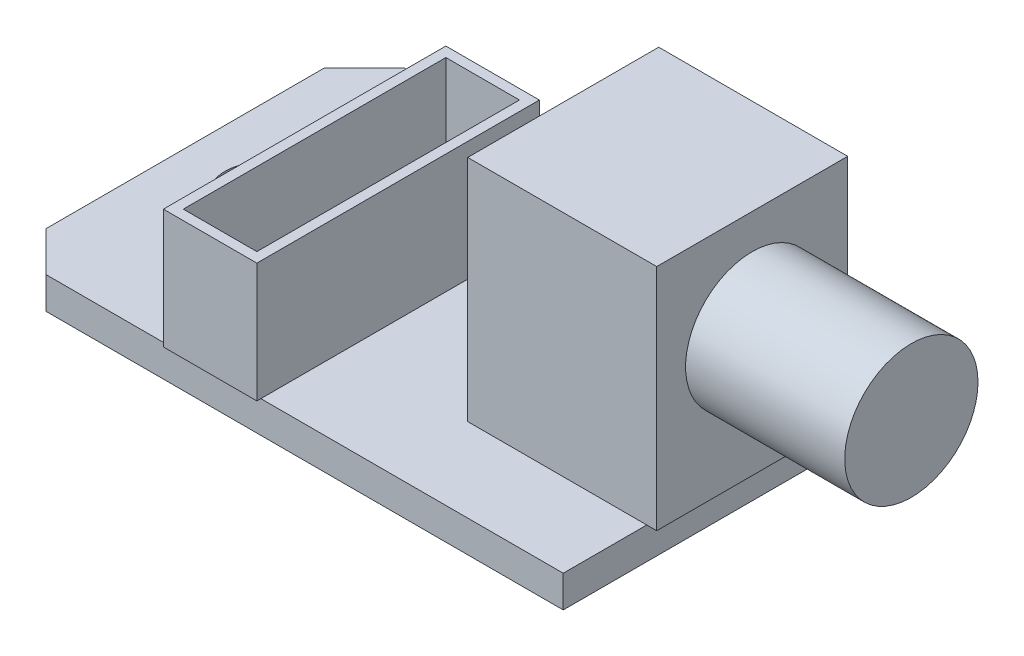
ISO-10303-21;
HEADER;
FILE_DESCRIPTION(('STEP AP214'),'2;1');
FILE_NAME('part.step','',(''),(''),'','','');
FILE_SCHEMA(('AUTOMOTIVE_DESIGN { 1 0 10303 214 1 1 1 1 }'));
ENDSEC;
DATA;
#1=APPLICATION_CONTEXT('core data for automotive mechanical design processes');
#2=APPLICATION_PROTOCOL_DEFINITION('international standard','automotive_design',2000,#1);
#3=PRODUCT_CONTEXT('',#1,'mechanical');
#4=PRODUCT('Part','Part','',(#3));
#5=PRODUCT_RELATED_PRODUCT_CATEGORY('part','',(#4));
#6=PRODUCT_DEFINITION_FORMATION('','',#4);
#7=PRODUCT_DEFINITION_CONTEXT('part definition',#1,'design');
#8=PRODUCT_DEFINITION('design','',#6,#7);
#9=PRODUCT_DEFINITION_SHAPE('','',#8);
#10=(LENGTH_UNIT() NAMED_UNIT(*) SI_UNIT(.MILLI.,.METRE.));
#11=(NAMED_UNIT(*) PLANE_ANGLE_UNIT() SI_UNIT($,.RADIAN.));
#12=(NAMED_UNIT(*) SI_UNIT($,.STERADIAN.) SOLID_ANGLE_UNIT());
#13=UNCERTAINTY_MEASURE_WITH_UNIT(LENGTH_MEASURE(1.E-05),#10,'distance_accuracy_value','');
#14=(GEOMETRIC_REPRESENTATION_CONTEXT(3) GLOBAL_UNCERTAINTY_ASSIGNED_CONTEXT((#13)) GLOBAL_UNIT_ASSIGNED_CONTEXT((#10,
#11,#12)) REPRESENTATION_CONTEXT('',''));
#15=CARTESIAN_POINT('',(0.,0.,0.));
#16=DIRECTION('',(0.,0.,1.));
#17=DIRECTION('',(1.,0.,0.));
#18=AXIS2_PLACEMENT_3D('',#15,#16,#17);
#19=CARTESIAN_POINT('',(0.,1.6,0.));
#20=DIRECTION('',(0.,1.,0.));
#21=DIRECTION('',(0.,0.,1.));
#22=AXIS2_PLACEMENT_3D('',#19,#20,#21);
#23=PLANE('',#22);
#24=CARTESIAN_POINT('',(-10.1,1.6,0.));
#25=DIRECTION('',(0.,1.,0.));
#26=DIRECTION('',(0.,0.,1.));
#27=AXIS2_PLACEMENT_3D('',#24,#25,#26);
#28=CIRCLE('',#27,1.9);
#29=CARTESIAN_POINT('',(-10.1,1.6,1.9));
#30=VERTEX_POINT('',#29);
#31=EDGE_CURVE('E205',#30,#30,#28,.T.);
#32=ORIENTED_EDGE('',*,*,#31,.F.);
#33=EDGE_LOOP('',(#32));
#34=FACE_BOUND('',#33,.T.);
#35=DIRECTION('',(-1.,0.,0.));
#36=VECTOR('',#35,1.);
#37=CARTESIAN_POINT('',(14.,1.6,-9.));
#38=LINE('',#37,#36);
#39=CARTESIAN_POINT('',(14.,1.6,-9.));
#40=VERTEX_POINT('',#39);
#41=CARTESIAN_POINT('',(-12.,1.6,-9.));
#42=VERTEX_POINT('',#41);
#43=EDGE_CURVE('E304',#40,#42,#38,.T.);
#44=ORIENTED_EDGE('',*,*,#43,.T.);
#45=DIRECTION('',(0.707106781186548,0.,-0.707106781186547));
#46=VECTOR('',#45,1.);
#47=CARTESIAN_POINT('',(-10.5,1.6,-10.5));
#48=LINE('',#47,#46);
#49=CARTESIAN_POINT('',(-14.,1.6,-6.99999999999999));
#50=VERTEX_POINT('',#49);
#51=EDGE_CURVE('E40',#42,#50,#48,.F.);
#52=ORIENTED_EDGE('',*,*,#51,.T.);
#53=DIRECTION('',(0.,0.,1.));
#54=VECTOR('',#53,1.);
#55=CARTESIAN_POINT('',(-14.,1.6,9.));
#56=LINE('',#55,#54);
#57=CARTESIAN_POINT('',(-14.,1.6,7.));
#58=VERTEX_POINT('',#57);
#59=EDGE_CURVE('E293',#50,#58,#56,.T.);
#60=ORIENTED_EDGE('',*,*,#59,.T.);
#61=DIRECTION('',(-0.707106781186547,0.,-0.707106781186548));
#62=VECTOR('',#61,1.);
#63=CARTESIAN_POINT('',(-10.5,1.6,10.5));
#64=LINE('',#63,#62);
#65=CARTESIAN_POINT('',(-12.,1.6,9.));
#66=VERTEX_POINT('',#65);
#67=EDGE_CURVE('E55',#58,#66,#64,.F.);
#68=ORIENTED_EDGE('',*,*,#67,.T.);
#69=DIRECTION('',(1.,0.,0.));
#70=VECTOR('',#69,1.);
#71=CARTESIAN_POINT('',(14.,1.6,9.));
#72=LINE('',#71,#70);
#73=CARTESIAN_POINT('',(-5.9,1.6,9.));
#74=VERTEX_POINT('',#73);
#75=EDGE_CURVE('E297',#66,#74,#72,.T.);
#76=ORIENTED_EDGE('',*,*,#75,.T.);
#77=DIRECTION('',(0.,0.,1.));
#78=VECTOR('',#77,1.);
#79=CARTESIAN_POINT('',(-5.9,1.6,-5.));
#80=LINE('',#79,#78);
#81=CARTESIAN_POINT('',(-5.9,1.6,-5.));
#82=VERTEX_POINT('',#81);
#83=EDGE_CURVE('E226',#82,#74,#80,.T.);
#84=ORIENTED_EDGE('',*,*,#83,.F.);
#85=DIRECTION('',(-1.,0.,0.));
#86=VECTOR('',#85,1.);
#87=CARTESIAN_POINT('',(-5.9,1.6,-5.));
#88=LINE('',#87,#86);
#89=CARTESIAN_POINT('',(-1.2,1.6,-5.));
#90=VERTEX_POINT('',#89);
#91=EDGE_CURVE('E219',#90,#82,#88,.T.);
#92=ORIENTED_EDGE('',*,*,#91,.F.);
#93=DIRECTION('',(0.,0.,-1.));
#94=VECTOR('',#93,1.);
#95=CARTESIAN_POINT('',(-1.2,1.6,-5.));
#96=LINE('',#95,#94);
#97=CARTESIAN_POINT('',(-1.2,1.6,9.));
#98=VERTEX_POINT('',#97);
#99=EDGE_CURVE('E231',#98,#90,#96,.T.);
#100=ORIENTED_EDGE('',*,*,#99,.F.);
#101=CARTESIAN_POINT('',(14.,1.6,9.));
#102=VERTEX_POINT('',#101);
#103=EDGE_CURVE('E295',#98,#102,#72,.T.);
#104=ORIENTED_EDGE('',*,*,#103,.T.);
#105=DIRECTION('',(0.,0.,-1.));
#106=VECTOR('',#105,1.);
#107=CARTESIAN_POINT('',(14.,1.6,9.));
#108=LINE('',#107,#106);
#109=CARTESIAN_POINT('',(14.,1.6,4.8));
#110=VERTEX_POINT('',#109);
#111=EDGE_CURVE('E301',#102,#110,#108,.T.);
#112=ORIENTED_EDGE('',*,*,#111,.T.);
#113=DIRECTION('',(1.,0.,0.));
#114=VECTOR('',#113,1.);
#115=CARTESIAN_POINT('',(5.,1.6,4.8));
#116=LINE('',#115,#114);
#117=CARTESIAN_POINT('',(5.,1.6,4.8));
#118=VERTEX_POINT('',#117);
#119=EDGE_CURVE('E290',#118,#110,#116,.T.);
#120=ORIENTED_EDGE('',*,*,#119,.F.);
#121=DIRECTION('',(0.,0.,-1.));
#122=VECTOR('',#121,1.);
#123=CARTESIAN_POINT('',(5.,1.6,4.8));
#124=LINE('',#123,#122);
#125=CARTESIAN_POINT('',(5.,1.6,-4.8));
#126=VERTEX_POINT('',#125);
#127=EDGE_CURVE('E271',#118,#126,#124,.T.);
#128=ORIENTED_EDGE('',*,*,#127,.T.);
#129=DIRECTION('',(1.,0.,0.));
#130=VECTOR('',#129,1.);
#131=CARTESIAN_POINT('',(5.,1.6,-4.8));
#132=LINE('',#131,#130);
#133=CARTESIAN_POINT('',(14.,1.6,-4.8));
#134=VERTEX_POINT('',#133);
#135=EDGE_CURVE('E286',#126,#134,#132,.T.);
#136=ORIENTED_EDGE('',*,*,#135,.T.);
#137=EDGE_CURVE('E299',#134,#40,#108,.T.);
#138=ORIENTED_EDGE('',*,*,#137,.T.);
#139=EDGE_LOOP('',(#44,#52,#60,#68,#76,#84,#92,#100,#104,#112,#120,#128,#136,#138));
#140=FACE_BOUND('',#139,.T.);
#141=ADVANCED_FACE('F32',(#34,#140),#23,.T.);
#142=CARTESIAN_POINT('',(-14.,1.6,9.));
#143=DIRECTION('',(1.,0.,0.));
#144=DIRECTION('',(0.,0.,-1.));
#145=AXIS2_PLACEMENT_3D('',#142,#143,#144);
#146=PLANE('',#145);
#147=ORIENTED_EDGE('',*,*,#59,.F.);
#148=DIRECTION('',(0.,-1.,0.));
#149=VECTOR('',#148,1.);
#150=CARTESIAN_POINT('',(-14.,1.6,-6.99999999999999));
#151=LINE('',#150,#149);
#152=CARTESIAN_POINT('',(-14.,0.,-6.99999999999999));
#153=VERTEX_POINT('',#152);
#154=EDGE_CURVE('E322',#50,#153,#151,.T.);
#155=ORIENTED_EDGE('',*,*,#154,.T.);
#156=DIRECTION('',(0.,0.,1.));
#157=VECTOR('',#156,1.);
#158=CARTESIAN_POINT('',(-14.,0.,9.));
#159=LINE('',#158,#157);
#160=CARTESIAN_POINT('',(-14.,0.,7.));
#161=VERTEX_POINT('',#160);
#162=EDGE_CURVE('E283',#153,#161,#159,.T.);
#163=ORIENTED_EDGE('',*,*,#162,.T.);
#164=DIRECTION('',(0.,1.,0.));
#165=VECTOR('',#164,1.);
#166=CARTESIAN_POINT('',(-14.,1.6,7.));
#167=LINE('',#166,#165);
#168=EDGE_CURVE('E255',#161,#58,#167,.T.);
#169=ORIENTED_EDGE('',*,*,#168,.T.);
#170=EDGE_LOOP('',(#147,#155,#163,#169));
#171=FACE_BOUND('',#170,.T.);
#172=ADVANCED_FACE('F338',(#171),#146,.F.);
#173=CARTESIAN_POINT('',(14.,1.6,9.));
#174=DIRECTION('',(0.,0.,-1.));
#175=DIRECTION('',(-1.,0.,0.));
#176=AXIS2_PLACEMENT_3D('',#173,#174,#175);
#177=PLANE('',#176);
#178=ORIENTED_EDGE('',*,*,#75,.F.);
#179=DIRECTION('',(0.,-1.,0.));
#180=VECTOR('',#179,1.);
#181=CARTESIAN_POINT('',(-12.,1.6,9.));
#182=LINE('',#181,#180);
#183=CARTESIAN_POINT('',(-12.,0.,9.));
#184=VERTEX_POINT('',#183);
#185=EDGE_CURVE('E11',#66,#184,#182,.T.);
#186=ORIENTED_EDGE('',*,*,#185,.T.);
#187=DIRECTION('',(1.,0.,0.));
#188=VECTOR('',#187,1.);
#189=CARTESIAN_POINT('',(14.,0.,9.));
#190=LINE('',#189,#188);
#191=CARTESIAN_POINT('',(14.,0.,9.));
#192=VERTEX_POINT('',#191);
#193=EDGE_CURVE('E311',#184,#192,#190,.T.);
#194=ORIENTED_EDGE('',*,*,#193,.T.);
#195=DIRECTION('',(0.,-1.,0.));
#196=VECTOR('',#195,1.);
#197=CARTESIAN_POINT('',(14.,1.6,9.));
#198=LINE('',#197,#196);
#199=EDGE_CURVE('E256',#102,#192,#198,.T.);
#200=ORIENTED_EDGE('',*,*,#199,.F.);
#201=ORIENTED_EDGE('',*,*,#103,.F.);
#202=EDGE_CURVE('E300',#74,#98,#72,.T.);
#203=ORIENTED_EDGE('',*,*,#202,.F.);
#204=EDGE_LOOP('',(#178,#186,#194,#200,#201,#203));
#205=FACE_BOUND('',#204,.T.);
#206=ADVANCED_FACE('F357',(#205),#177,.F.);
#207=CARTESIAN_POINT('',(14.,1.6,9.));
#208=DIRECTION('',(-1.,0.,0.));
#209=DIRECTION('',(0.,0.,1.));
#210=AXIS2_PLACEMENT_3D('',#207,#208,#209);
#211=PLANE('',#210);
#212=DIRECTION('',(0.,0.,-1.));
#213=VECTOR('',#212,1.);
#214=CARTESIAN_POINT('',(14.,0.,9.));
#215=LINE('',#214,#213);
#216=CARTESIAN_POINT('',(14.,0.,-9.));
#217=VERTEX_POINT('',#216);
#218=EDGE_CURVE('E313',#192,#217,#215,.T.);
#219=ORIENTED_EDGE('',*,*,#218,.T.);
#220=DIRECTION('',(0.,-1.,0.));
#221=VECTOR('',#220,1.);
#222=CARTESIAN_POINT('',(14.,1.6,-9.));
#223=LINE('',#222,#221);
#224=EDGE_CURVE('E308',#40,#217,#223,.T.);
#225=ORIENTED_EDGE('',*,*,#224,.F.);
#226=ORIENTED_EDGE('',*,*,#137,.F.);
#227=EDGE_CURVE('E305',#110,#134,#108,.T.);
#228=ORIENTED_EDGE('',*,*,#227,.F.);
#229=ORIENTED_EDGE('',*,*,#111,.F.);
#230=ORIENTED_EDGE('',*,*,#199,.T.);
#231=EDGE_LOOP('',(#219,#225,#226,#228,#229,#230));
#232=FACE_BOUND('',#231,.T.);
#233=ADVANCED_FACE('F351',(#232),#211,.F.);
#234=CARTESIAN_POINT('',(14.,1.6,-9.));
#235=DIRECTION('',(0.,0.,1.));
#236=DIRECTION('',(1.,0.,0.));
#237=AXIS2_PLACEMENT_3D('',#234,#235,#236);
#238=PLANE('',#237);
#239=DIRECTION('',(-1.,0.,0.));
#240=VECTOR('',#239,1.);
#241=CARTESIAN_POINT('',(14.,0.,-9.));
#242=LINE('',#241,#240);
#243=CARTESIAN_POINT('',(-12.,0.,-9.));
#244=VERTEX_POINT('',#243);
#245=EDGE_CURVE('E296',#217,#244,#242,.T.);
#246=ORIENTED_EDGE('',*,*,#245,.T.);
#247=DIRECTION('',(0.,1.,0.));
#248=VECTOR('',#247,1.);
#249=CARTESIAN_POINT('',(-12.,1.6,-9.));
#250=LINE('',#249,#248);
#251=EDGE_CURVE('E329',#244,#42,#250,.T.);
#252=ORIENTED_EDGE('',*,*,#251,.T.);
#253=ORIENTED_EDGE('',*,*,#43,.F.);
#254=ORIENTED_EDGE('',*,*,#224,.T.);
#255=EDGE_LOOP('',(#246,#252,#253,#254));
#256=FACE_BOUND('',#255,.T.);
#257=ADVANCED_FACE('F347',(#256),#238,.F.);
#258=CARTESIAN_POINT('',(0.,0.,0.));
#259=DIRECTION('',(0.,1.,0.));
#260=DIRECTION('',(0.,0.,1.));
#261=AXIS2_PLACEMENT_3D('',#258,#259,#260);
#262=PLANE('',#261);
#263=CARTESIAN_POINT('',(-10.1,0.,0.));
#264=DIRECTION('',(0.,1.,0.));
#265=DIRECTION('',(0.,0.,1.));
#266=AXIS2_PLACEMENT_3D('',#263,#264,#265);
#267=CIRCLE('',#266,1.9);
#268=CARTESIAN_POINT('',(-10.1,0.,1.9));
#269=VERTEX_POINT('',#268);
#270=EDGE_CURVE('E209',#269,#269,#267,.T.);
#271=ORIENTED_EDGE('',*,*,#270,.T.);
#272=EDGE_LOOP('',(#271));
#273=FACE_BOUND('',#272,.T.);
#274=ORIENTED_EDGE('',*,*,#162,.F.);
#275=DIRECTION('',(-0.707106781186548,0.,0.707106781186547));
#276=VECTOR('',#275,1.);
#277=CARTESIAN_POINT('',(-14.,0.,-6.99999999999999));
#278=LINE('',#277,#276);
#279=EDGE_CURVE('E327',#153,#244,#278,.F.);
#280=ORIENTED_EDGE('',*,*,#279,.T.);
#281=ORIENTED_EDGE('',*,*,#245,.F.);
#282=ORIENTED_EDGE('',*,*,#218,.F.);
#283=ORIENTED_EDGE('',*,*,#193,.F.);
#284=DIRECTION('',(0.707106781186547,0.,0.707106781186548));
#285=VECTOR('',#284,1.);
#286=CARTESIAN_POINT('',(-12.,0.,9.));
#287=LINE('',#286,#285);
#288=EDGE_CURVE('E325',#184,#161,#287,.F.);
#289=ORIENTED_EDGE('',*,*,#288,.T.);
#290=EDGE_LOOP('',(#274,#280,#281,#282,#283,#289));
#291=FACE_BOUND('',#290,.T.);
#292=ADVANCED_FACE('F344',(#273,#291),#262,.F.);
#293=CARTESIAN_POINT('',(5.,13.1,4.8));
#294=DIRECTION('',(0.,0.,1.));
#295=DIRECTION('',(0.,-1.,0.));
#296=AXIS2_PLACEMENT_3D('',#293,#294,#295);
#297=PLANE('',#296);
#298=ORIENTED_EDGE('',*,*,#119,.T.);
#299=CARTESIAN_POINT('',(14.5,1.6,4.8));
#300=VERTEX_POINT('',#299);
#301=EDGE_CURVE('E280',#110,#300,#116,.T.);
#302=ORIENTED_EDGE('',*,*,#301,.T.);
#303=DIRECTION('',(0.,-1.,0.));
#304=VECTOR('',#303,1.);
#305=CARTESIAN_POINT('',(14.5,13.1,4.8));
#306=LINE('',#305,#304);
#307=CARTESIAN_POINT('',(14.5,13.1,4.8));
#308=VERTEX_POINT('',#307);
#309=EDGE_CURVE('E251',#308,#300,#306,.T.);
#310=ORIENTED_EDGE('',*,*,#309,.F.);
#311=DIRECTION('',(1.,0.,0.));
#312=VECTOR('',#311,1.);
#313=CARTESIAN_POINT('',(5.,13.1,4.8));
#314=LINE('',#313,#312);
#315=CARTESIAN_POINT('',(5.,13.1,4.8));
#316=VERTEX_POINT('',#315);
#317=EDGE_CURVE('E281',#316,#308,#314,.T.);
#318=ORIENTED_EDGE('',*,*,#317,.F.);
#319=DIRECTION('',(0.,-1.,0.));
#320=VECTOR('',#319,1.);
#321=CARTESIAN_POINT('',(5.,13.1,4.8));
#322=LINE('',#321,#320);
#323=EDGE_CURVE('E268',#316,#118,#322,.T.);
#324=ORIENTED_EDGE('',*,*,#323,.T.);
#325=EDGE_LOOP('',(#298,#302,#310,#318,#324));
#326=FACE_BOUND('',#325,.T.);
#327=ADVANCED_FACE('F379',(#326),#297,.T.);
#328=CARTESIAN_POINT('',(5.,13.1,4.8));
#329=DIRECTION('',(0.,1.,0.));
#330=DIRECTION('',(0.,0.,1.));
#331=AXIS2_PLACEMENT_3D('',#328,#329,#330);
#332=PLANE('',#331);
#333=ORIENTED_EDGE('',*,*,#317,.T.);
#334=DIRECTION('',(0.,0.,1.));
#335=VECTOR('',#334,1.);
#336=CARTESIAN_POINT('',(14.5,13.1,4.8));
#337=LINE('',#336,#335);
#338=CARTESIAN_POINT('',(14.5,13.1,-4.8));
#339=VERTEX_POINT('',#338);
#340=EDGE_CURVE('E265',#339,#308,#337,.T.);
#341=ORIENTED_EDGE('',*,*,#340,.F.);
#342=DIRECTION('',(1.,0.,0.));
#343=VECTOR('',#342,1.);
#344=CARTESIAN_POINT('',(5.,13.1,-4.8));
#345=LINE('',#344,#343);
#346=CARTESIAN_POINT('',(5.,13.1,-4.8));
#347=VERTEX_POINT('',#346);
#348=EDGE_CURVE('E284',#347,#339,#345,.T.);
#349=ORIENTED_EDGE('',*,*,#348,.F.);
#350=DIRECTION('',(0.,0.,1.));
#351=VECTOR('',#350,1.);
#352=CARTESIAN_POINT('',(5.,13.1,4.8));
#353=LINE('',#352,#351);
#354=EDGE_CURVE('E277',#347,#316,#353,.T.);
#355=ORIENTED_EDGE('',*,*,#354,.T.);
#356=EDGE_LOOP('',(#333,#341,#349,#355));
#357=FACE_BOUND('',#356,.T.);
#358=ADVANCED_FACE('F412',(#357),#332,.T.);
#359=CARTESIAN_POINT('',(5.,13.1,-4.8));
#360=DIRECTION('',(0.,0.,-1.));
#361=DIRECTION('',(-1.,0.,0.));
#362=AXIS2_PLACEMENT_3D('',#359,#360,#361);
#363=PLANE('',#362);
#364=ORIENTED_EDGE('',*,*,#348,.T.);
#365=DIRECTION('',(0.,1.,0.));
#366=VECTOR('',#365,1.);
#367=CARTESIAN_POINT('',(14.5,13.1,-4.8));
#368=LINE('',#367,#366);
#369=CARTESIAN_POINT('',(14.5,1.6,-4.8));
#370=VERTEX_POINT('',#369);
#371=EDGE_CURVE('E262',#370,#339,#368,.T.);
#372=ORIENTED_EDGE('',*,*,#371,.F.);
#373=EDGE_CURVE('E289',#134,#370,#132,.T.);
#374=ORIENTED_EDGE('',*,*,#373,.F.);
#375=ORIENTED_EDGE('',*,*,#135,.F.);
#376=DIRECTION('',(0.,1.,0.));
#377=VECTOR('',#376,1.);
#378=CARTESIAN_POINT('',(5.,13.1,-4.8));
#379=LINE('',#378,#377);
#380=EDGE_CURVE('E274',#126,#347,#379,.T.);
#381=ORIENTED_EDGE('',*,*,#380,.T.);
#382=EDGE_LOOP('',(#364,#372,#374,#375,#381));
#383=FACE_BOUND('',#382,.T.);
#384=ADVANCED_FACE('F419',(#383),#363,.T.);
#385=CARTESIAN_POINT('',(5.,1.6,4.8));
#386=DIRECTION('',(0.,-1.,0.));
#387=DIRECTION('',(0.,0.,-1.));
#388=AXIS2_PLACEMENT_3D('',#385,#386,#387);
#389=PLANE('',#388);
#390=ORIENTED_EDGE('',*,*,#301,.F.);
#391=ORIENTED_EDGE('',*,*,#227,.T.);
#392=ORIENTED_EDGE('',*,*,#373,.T.);
#393=DIRECTION('',(0.,0.,-1.));
#394=VECTOR('',#393,1.);
#395=CARTESIAN_POINT('',(14.5,1.6,4.8));
#396=LINE('',#395,#394);
#397=EDGE_CURVE('E259',#300,#370,#396,.T.);
#398=ORIENTED_EDGE('',*,*,#397,.F.);
#399=EDGE_LOOP('',(#390,#391,#392,#398));
#400=FACE_BOUND('',#399,.T.);
#401=ADVANCED_FACE('F427',(#400),#389,.T.);
#402=CARTESIAN_POINT('',(5.,0.,0.));
#403=DIRECTION('',(1.,0.,0.));
#404=DIRECTION('',(0.,0.,-1.));
#405=AXIS2_PLACEMENT_3D('',#402,#403,#404);
#406=PLANE('',#405);
#407=ORIENTED_EDGE('',*,*,#323,.F.);
#408=ORIENTED_EDGE('',*,*,#354,.F.);
#409=ORIENTED_EDGE('',*,*,#380,.F.);
#410=ORIENTED_EDGE('',*,*,#127,.F.);
#411=EDGE_LOOP('',(#407,#408,#409,#410));
#412=FACE_BOUND('',#411,.T.);
#413=ADVANCED_FACE('F435',(#412),#406,.F.);
#414=CARTESIAN_POINT('',(14.5,0.,0.));
#415=DIRECTION('',(1.,0.,0.));
#416=DIRECTION('',(0.,0.,-1.));
#417=AXIS2_PLACEMENT_3D('',#414,#415,#416);
#418=PLANE('',#417);
#419=CARTESIAN_POINT('',(14.5,8.,0.));
#420=DIRECTION('',(1.,0.,0.));
#421=DIRECTION('',(0.,0.,-1.));
#422=AXIS2_PLACEMENT_3D('',#419,#420,#421);
#423=CIRCLE('',#422,3.35);
#424=CARTESIAN_POINT('',(14.5,8.,-3.35));
#425=VERTEX_POINT('',#424);
#426=EDGE_CURVE('E252',#425,#425,#423,.T.);
#427=ORIENTED_EDGE('',*,*,#426,.F.);
#428=EDGE_LOOP('',(#427));
#429=FACE_BOUND('',#428,.T.);
#430=ORIENTED_EDGE('',*,*,#309,.T.);
#431=ORIENTED_EDGE('',*,*,#397,.T.);
#432=ORIENTED_EDGE('',*,*,#371,.T.);
#433=ORIENTED_EDGE('',*,*,#340,.T.);
#434=EDGE_LOOP('',(#430,#431,#432,#433));
#435=FACE_BOUND('',#434,.T.);
#436=ADVANCED_FACE('F442',(#429,#435),#418,.T.);
#437=CARTESIAN_POINT('',(22.5,8.,0.));
#438=DIRECTION('',(-1.,0.,0.));
#439=DIRECTION('',(0.,0.,1.));
#440=AXIS2_PLACEMENT_3D('',#437,#438,#439);
#441=CYLINDRICAL_SURFACE('',#440,3.35);
#442=CARTESIAN_POINT('',(22.5,8.,0.));
#443=DIRECTION('',(1.,0.,0.));
#444=DIRECTION('',(0.,0.,-1.));
#445=AXIS2_PLACEMENT_3D('',#442,#443,#444);
#446=CIRCLE('',#445,3.35);
#447=CARTESIAN_POINT('',(22.5,8.,-3.35));
#448=VERTEX_POINT('',#447);
#449=EDGE_CURVE('E248',#448,#448,#446,.T.);
#450=ORIENTED_EDGE('',*,*,#449,.F.);
#451=EDGE_LOOP('',(#450));
#452=FACE_BOUND('',#451,.T.);
#453=ORIENTED_EDGE('',*,*,#426,.T.);
#454=EDGE_LOOP('',(#453));
#455=FACE_BOUND('',#454,.T.);
#456=ADVANCED_FACE('F450',(#452,#455),#441,.T.);
#457=CARTESIAN_POINT('',(22.5,8.,0.));
#458=DIRECTION('',(1.,0.,0.));
#459=DIRECTION('',(0.,0.,-1.));
#460=AXIS2_PLACEMENT_3D('',#457,#458,#459);
#461=PLANE('',#460);
#462=ORIENTED_EDGE('',*,*,#449,.T.);
#463=EDGE_LOOP('',(#462));
#464=FACE_BOUND('',#463,.T.);
#465=ADVANCED_FACE('F458',(#464),#461,.T.);
#466=CARTESIAN_POINT('',(0.,1.6,0.));
#467=DIRECTION('',(0.,1.,0.));
#468=DIRECTION('',(0.,0.,1.));
#469=AXIS2_PLACEMENT_3D('',#466,#467,#468);
#470=PLANE('',#469);
#471=CARTESIAN_POINT('',(-5.9,1.6,9.2));
#472=VERTEX_POINT('',#471);
#473=EDGE_CURVE('E212',#74,#472,#80,.T.);
#474=ORIENTED_EDGE('',*,*,#473,.F.);
#475=ORIENTED_EDGE('',*,*,#202,.T.);
#476=CARTESIAN_POINT('',(-1.2,1.6,9.2));
#477=VERTEX_POINT('',#476);
#478=EDGE_CURVE('E232',#477,#98,#96,.T.);
#479=ORIENTED_EDGE('',*,*,#478,.F.);
#480=DIRECTION('',(1.,0.,0.));
#481=VECTOR('',#480,1.);
#482=CARTESIAN_POINT('',(-5.9,1.6,9.2));
#483=LINE('',#482,#481);
#484=EDGE_CURVE('E229',#472,#477,#483,.T.);
#485=ORIENTED_EDGE('',*,*,#484,.F.);
#486=EDGE_LOOP('',(#474,#475,#479,#485));
#487=FACE_BOUND('',#486,.T.);
#488=ADVANCED_FACE('F466',(#487),#470,.F.);
#489=CARTESIAN_POINT('',(-5.9,7.6,-5.));
#490=DIRECTION('',(1.,0.,0.));
#491=DIRECTION('',(0.,0.,-1.));
#492=AXIS2_PLACEMENT_3D('',#489,#490,#491);
#493=PLANE('',#492);
#494=ORIENTED_EDGE('',*,*,#83,.T.);
#495=ORIENTED_EDGE('',*,*,#473,.T.);
#496=DIRECTION('',(0.,-1.,0.));
#497=VECTOR('',#496,1.);
#498=CARTESIAN_POINT('',(-5.9,7.6,9.2));
#499=LINE('',#498,#497);
#500=CARTESIAN_POINT('',(-5.9,7.6,9.2));
#501=VERTEX_POINT('',#500);
#502=EDGE_CURVE('E245',#501,#472,#499,.T.);
#503=ORIENTED_EDGE('',*,*,#502,.F.);
#504=DIRECTION('',(0.,0.,1.));
#505=VECTOR('',#504,1.);
#506=CARTESIAN_POINT('',(-5.9,7.6,-5.));
#507=LINE('',#506,#505);
#508=CARTESIAN_POINT('',(-5.9,7.6,-5.));
#509=VERTEX_POINT('',#508);
#510=EDGE_CURVE('E215',#509,#501,#507,.T.);
#511=ORIENTED_EDGE('',*,*,#510,.F.);
#512=DIRECTION('',(0.,-1.,0.));
#513=VECTOR('',#512,1.);
#514=CARTESIAN_POINT('',(-5.9,7.6,-5.));
#515=LINE('',#514,#513);
#516=EDGE_CURVE('E225',#509,#82,#515,.T.);
#517=ORIENTED_EDGE('',*,*,#516,.T.);
#518=EDGE_LOOP('',(#494,#495,#503,#511,#517));
#519=FACE_BOUND('',#518,.T.);
#520=ADVANCED_FACE('F474',(#519),#493,.F.);
#521=CARTESIAN_POINT('',(-5.9,7.6,9.2));
#522=DIRECTION('',(0.,0.,-1.));
#523=DIRECTION('',(-1.,0.,0.));
#524=AXIS2_PLACEMENT_3D('',#521,#522,#523);
#525=PLANE('',#524);
#526=ORIENTED_EDGE('',*,*,#484,.T.);
#527=DIRECTION('',(0.,-1.,0.));
#528=VECTOR('',#527,1.);
#529=CARTESIAN_POINT('',(-1.2,7.6,9.2));
#530=LINE('',#529,#528);
#531=CARTESIAN_POINT('',(-1.2,7.6,9.2));
#532=VERTEX_POINT('',#531);
#533=EDGE_CURVE('E242',#532,#477,#530,.T.);
#534=ORIENTED_EDGE('',*,*,#533,.F.);
#535=DIRECTION('',(1.,0.,0.));
#536=VECTOR('',#535,1.);
#537=CARTESIAN_POINT('',(-5.9,7.6,9.2));
#538=LINE('',#537,#536);
#539=EDGE_CURVE('E218',#501,#532,#538,.T.);
#540=ORIENTED_EDGE('',*,*,#539,.F.);
#541=ORIENTED_EDGE('',*,*,#502,.T.);
#542=EDGE_LOOP('',(#526,#534,#540,#541));
#543=FACE_BOUND('',#542,.T.);
#544=ADVANCED_FACE('F482',(#543),#525,.F.);
#545=CARTESIAN_POINT('',(-1.2,7.6,-5.));
#546=DIRECTION('',(-1.,0.,0.));
#547=DIRECTION('',(0.,0.,1.));
#548=AXIS2_PLACEMENT_3D('',#545,#546,#547);
#549=PLANE('',#548);
#550=ORIENTED_EDGE('',*,*,#478,.T.);
#551=ORIENTED_EDGE('',*,*,#99,.T.);
#552=DIRECTION('',(0.,-1.,0.));
#553=VECTOR('',#552,1.);
#554=CARTESIAN_POINT('',(-1.2,7.6,-5.));
#555=LINE('',#554,#553);
#556=CARTESIAN_POINT('',(-1.2,7.6,-5.));
#557=VERTEX_POINT('',#556);
#558=EDGE_CURVE('E239',#557,#90,#555,.T.);
#559=ORIENTED_EDGE('',*,*,#558,.F.);
#560=DIRECTION('',(0.,0.,-1.));
#561=VECTOR('',#560,1.);
#562=CARTESIAN_POINT('',(-1.2,7.6,-5.));
#563=LINE('',#562,#561);
#564=EDGE_CURVE('E221',#532,#557,#563,.T.);
#565=ORIENTED_EDGE('',*,*,#564,.F.);
#566=ORIENTED_EDGE('',*,*,#533,.T.);
#567=EDGE_LOOP('',(#550,#551,#559,#565,#566));
#568=FACE_BOUND('',#567,.T.);
#569=ADVANCED_FACE('F490',(#568),#549,.F.);
#570=CARTESIAN_POINT('',(-5.9,7.6,-5.));
#571=DIRECTION('',(0.,0.,1.));
#572=DIRECTION('',(1.,0.,0.));
#573=AXIS2_PLACEMENT_3D('',#570,#571,#572);
#574=PLANE('',#573);
#575=ORIENTED_EDGE('',*,*,#91,.T.);
#576=ORIENTED_EDGE('',*,*,#516,.F.);
#577=DIRECTION('',(-1.,0.,0.));
#578=VECTOR('',#577,1.);
#579=CARTESIAN_POINT('',(-5.9,7.6,-5.));
#580=LINE('',#579,#578);
#581=EDGE_CURVE('E223',#557,#509,#580,.T.);
#582=ORIENTED_EDGE('',*,*,#581,.F.);
#583=ORIENTED_EDGE('',*,*,#558,.T.);
#584=EDGE_LOOP('',(#575,#576,#582,#583));
#585=FACE_BOUND('',#584,.T.);
#586=ADVANCED_FACE('F498',(#585),#574,.F.);
#587=CARTESIAN_POINT('',(0.,7.6,0.));
#588=DIRECTION('',(0.,1.,0.));
#589=DIRECTION('',(0.,0.,1.));
#590=AXIS2_PLACEMENT_3D('',#587,#588,#589);
#591=PLANE('',#590);
#592=DIRECTION('',(0.,0.,-1.));
#593=VECTOR('',#592,1.);
#594=CARTESIAN_POINT('',(-1.7,7.6,0.));
#595=LINE('',#594,#593);
#596=CARTESIAN_POINT('',(-1.7,7.6,8.7));
#597=VERTEX_POINT('',#596);
#598=CARTESIAN_POINT('',(-1.7,7.6,-4.5));
#599=VERTEX_POINT('',#598);
#600=EDGE_CURVE('E47',#597,#599,#595,.T.);
#601=ORIENTED_EDGE('',*,*,#600,.F.);
#602=DIRECTION('',(1.,0.,0.));
#603=VECTOR('',#602,1.);
#604=CARTESIAN_POINT('',(0.,7.6,8.7));
#605=LINE('',#604,#603);
#606=CARTESIAN_POINT('',(-5.4,7.6,8.7));
#607=VERTEX_POINT('',#606);
#608=EDGE_CURVE('E190',#607,#597,#605,.T.);
#609=ORIENTED_EDGE('',*,*,#608,.F.);
#610=DIRECTION('',(0.,0.,1.));
#611=VECTOR('',#610,1.);
#612=CARTESIAN_POINT('',(-5.4,7.6,0.));
#613=LINE('',#612,#611);
#614=CARTESIAN_POINT('',(-5.4,7.6,-4.5));
#615=VERTEX_POINT('',#614);
#616=EDGE_CURVE('E193',#615,#607,#613,.T.);
#617=ORIENTED_EDGE('',*,*,#616,.F.);
#618=DIRECTION('',(-1.,0.,0.));
#619=VECTOR('',#618,1.);
#620=CARTESIAN_POINT('',(0.,7.6,-4.5));
#621=LINE('',#620,#619);
#622=EDGE_CURVE('E199',#599,#615,#621,.T.);
#623=ORIENTED_EDGE('',*,*,#622,.F.);
#624=EDGE_LOOP('',(#601,#609,#617,#623));
#625=FACE_BOUND('',#624,.T.);
#626=ORIENTED_EDGE('',*,*,#510,.T.);
#627=ORIENTED_EDGE('',*,*,#539,.T.);
#628=ORIENTED_EDGE('',*,*,#564,.T.);
#629=ORIENTED_EDGE('',*,*,#581,.T.);
#630=EDGE_LOOP('',(#626,#627,#628,#629));
#631=FACE_BOUND('',#630,.T.);
#632=ADVANCED_FACE('F506',(#625,#631),#591,.T.);
#633=CARTESIAN_POINT('',(-10.1,0.,0.));
#634=DIRECTION('',(0.,1.,0.));
#635=DIRECTION('',(0.,0.,1.));
#636=AXIS2_PLACEMENT_3D('',#633,#634,#635);
#637=CYLINDRICAL_SURFACE('',#636,1.9);
#638=ORIENTED_EDGE('',*,*,#270,.F.);
#639=EDGE_LOOP('',(#638));
#640=FACE_BOUND('',#639,.T.);
#641=ORIENTED_EDGE('',*,*,#31,.T.);
#642=EDGE_LOOP('',(#641));
#643=FACE_BOUND('',#642,.T.);
#644=ADVANCED_FACE('F368',(#640,#643),#637,.F.);
#645=CARTESIAN_POINT('',(-14.,1.6,-6.99999999999999));
#646=DIRECTION('',(0.707106781186547,0.,0.707106781186548));
#647=DIRECTION('',(0.,-1.,0.));
#648=AXIS2_PLACEMENT_3D('',#645,#646,#647);
#649=PLANE('',#648);
#650=ORIENTED_EDGE('',*,*,#51,.F.);
#651=ORIENTED_EDGE('',*,*,#251,.F.);
#652=ORIENTED_EDGE('',*,*,#279,.F.);
#653=ORIENTED_EDGE('',*,*,#154,.F.);
#654=EDGE_LOOP('',(#650,#651,#652,#653));
#655=FACE_BOUND('',#654,.T.);
#656=ADVANCED_FACE('F341',(#655),#649,.F.);
#657=CARTESIAN_POINT('',(-12.,1.6,9.));
#658=DIRECTION('',(0.707106781186548,0.,-0.707106781186547));
#659=DIRECTION('',(0.,-1.,0.));
#660=AXIS2_PLACEMENT_3D('',#657,#658,#659);
#661=PLANE('',#660);
#662=ORIENTED_EDGE('',*,*,#67,.F.);
#663=ORIENTED_EDGE('',*,*,#168,.F.);
#664=ORIENTED_EDGE('',*,*,#288,.F.);
#665=ORIENTED_EDGE('',*,*,#185,.F.);
#666=EDGE_LOOP('',(#662,#663,#664,#665));
#667=FACE_BOUND('',#666,.T.);
#668=ADVANCED_FACE('F34',(#667),#661,.F.);
#669=CARTESIAN_POINT('',(-1.7,2.6,0.));
#670=DIRECTION('',(1.,0.,0.));
#671=DIRECTION('',(0.,0.,-1.));
#672=AXIS2_PLACEMENT_3D('',#669,#670,#671);
#673=PLANE('',#672);
#674=ORIENTED_EDGE('',*,*,#600,.T.);
#675=DIRECTION('',(0.,1.,0.));
#676=VECTOR('',#675,1.);
#677=CARTESIAN_POINT('',(-1.7,2.6,-4.5));
#678=LINE('',#677,#676);
#679=CARTESIAN_POINT('',(-1.7,2.6,-4.5));
#680=VERTEX_POINT('',#679);
#681=EDGE_CURVE('E168',#680,#599,#678,.T.);
#682=ORIENTED_EDGE('',*,*,#681,.F.);
#683=DIRECTION('',(0.,0.,-1.));
#684=VECTOR('',#683,1.);
#685=CARTESIAN_POINT('',(-1.7,2.6,0.));
#686=LINE('',#685,#684);
#687=CARTESIAN_POINT('',(-1.7,2.6,8.7));
#688=VERTEX_POINT('',#687);
#689=EDGE_CURVE('E172',#688,#680,#686,.T.);
#690=ORIENTED_EDGE('',*,*,#689,.F.);
#691=DIRECTION('',(0.,1.,0.));
#692=VECTOR('',#691,1.);
#693=CARTESIAN_POINT('',(-1.7,2.6,8.7));
#694=LINE('',#693,#692);
#695=EDGE_CURVE('E203',#688,#597,#694,.T.);
#696=ORIENTED_EDGE('',*,*,#695,.T.);
#697=EDGE_LOOP('',(#674,#682,#690,#696));
#698=FACE_BOUND('',#697,.T.);
#699=ADVANCED_FACE('F170',(#698),#673,.F.);
#700=CARTESIAN_POINT('',(0.,2.6,8.7));
#701=DIRECTION('',(0.,0.,1.));
#702=DIRECTION('',(1.,0.,0.));
#703=AXIS2_PLACEMENT_3D('',#700,#701,#702);
#704=PLANE('',#703);
#705=ORIENTED_EDGE('',*,*,#608,.T.);
#706=ORIENTED_EDGE('',*,*,#695,.F.);
#707=DIRECTION('',(1.,0.,0.));
#708=VECTOR('',#707,1.);
#709=CARTESIAN_POINT('',(0.,2.6,8.7));
#710=LINE('',#709,#708);
#711=CARTESIAN_POINT('',(-5.4,2.6,8.7));
#712=VERTEX_POINT('',#711);
#713=EDGE_CURVE('E178',#712,#688,#710,.T.);
#714=ORIENTED_EDGE('',*,*,#713,.F.);
#715=DIRECTION('',(0.,1.,0.));
#716=VECTOR('',#715,1.);
#717=CARTESIAN_POINT('',(-5.4,2.6,8.7));
#718=LINE('',#717,#716);
#719=EDGE_CURVE('E206',#712,#607,#718,.T.);
#720=ORIENTED_EDGE('',*,*,#719,.T.);
#721=EDGE_LOOP('',(#705,#706,#714,#720));
#722=FACE_BOUND('',#721,.T.);
#723=ADVANCED_FACE('F366',(#722),#704,.F.);
#724=CARTESIAN_POINT('',(-5.4,2.6,0.));
#725=DIRECTION('',(-1.,0.,0.));
#726=DIRECTION('',(0.,0.,1.));
#727=AXIS2_PLACEMENT_3D('',#724,#725,#726);
#728=PLANE('',#727);
#729=ORIENTED_EDGE('',*,*,#616,.T.);
#730=ORIENTED_EDGE('',*,*,#719,.F.);
#731=DIRECTION('',(0.,0.,1.));
#732=VECTOR('',#731,1.);
#733=CARTESIAN_POINT('',(-5.4,2.6,0.));
#734=LINE('',#733,#732);
#735=CARTESIAN_POINT('',(-5.4,2.6,-4.5));
#736=VERTEX_POINT('',#735);
#737=EDGE_CURVE('E186',#736,#712,#734,.T.);
#738=ORIENTED_EDGE('',*,*,#737,.F.);
#739=DIRECTION('',(0.,1.,0.));
#740=VECTOR('',#739,1.);
#741=CARTESIAN_POINT('',(-5.4,2.6,-4.5));
#742=LINE('',#741,#740);
#743=EDGE_CURVE('E177',#736,#615,#742,.T.);
#744=ORIENTED_EDGE('',*,*,#743,.T.);
#745=EDGE_LOOP('',(#729,#730,#738,#744));
#746=FACE_BOUND('',#745,.T.);
#747=ADVANCED_FACE('F544',(#746),#728,.F.);
#748=CARTESIAN_POINT('',(0.,2.6,-4.5));
#749=DIRECTION('',(0.,0.,-1.));
#750=DIRECTION('',(-1.,0.,0.));
#751=AXIS2_PLACEMENT_3D('',#748,#749,#750);
#752=PLANE('',#751);
#753=ORIENTED_EDGE('',*,*,#622,.T.);
#754=ORIENTED_EDGE('',*,*,#743,.F.);
#755=DIRECTION('',(-1.,0.,0.));
#756=VECTOR('',#755,1.);
#757=CARTESIAN_POINT('',(0.,2.6,-4.5));
#758=LINE('',#757,#756);
#759=EDGE_CURVE('E181',#680,#736,#758,.T.);
#760=ORIENTED_EDGE('',*,*,#759,.F.);
#761=ORIENTED_EDGE('',*,*,#681,.T.);
#762=EDGE_LOOP('',(#753,#754,#760,#761));
#763=FACE_BOUND('',#762,.T.);
#764=ADVANCED_FACE('F182',(#763),#752,.F.);
#765=CARTESIAN_POINT('',(0.,2.6,0.));
#766=DIRECTION('',(0.,1.,0.));
#767=DIRECTION('',(0.,0.,1.));
#768=AXIS2_PLACEMENT_3D('',#765,#766,#767);
#769=PLANE('',#768);
#770=ORIENTED_EDGE('',*,*,#689,.T.);
#771=ORIENTED_EDGE('',*,*,#759,.T.);
#772=ORIENTED_EDGE('',*,*,#737,.T.);
#773=ORIENTED_EDGE('',*,*,#713,.T.);
#774=EDGE_LOOP('',(#770,#771,#772,#773));
#775=FACE_BOUND('',#774,.T.);
#776=ADVANCED_FACE('F188',(#775),#769,.T.);
#777=CLOSED_SHELL('',(#141,#172,#206,#233,#257,#292,#327,#358,#384,#401,#413,#436,#456,#465,
#488,#520,#544,#569,#586,#632,#644,#656,#668,#699,#723,#747,#764,#776));
#778=MANIFOLD_SOLID_BREP('B2',#777);
#779=ADVANCED_BREP_SHAPE_REPRESENTATION('',(#18,#778),#14);
#780=SHAPE_DEFINITION_REPRESENTATION(#9,#779);
ENDSEC;
END-ISO-10303-21;
